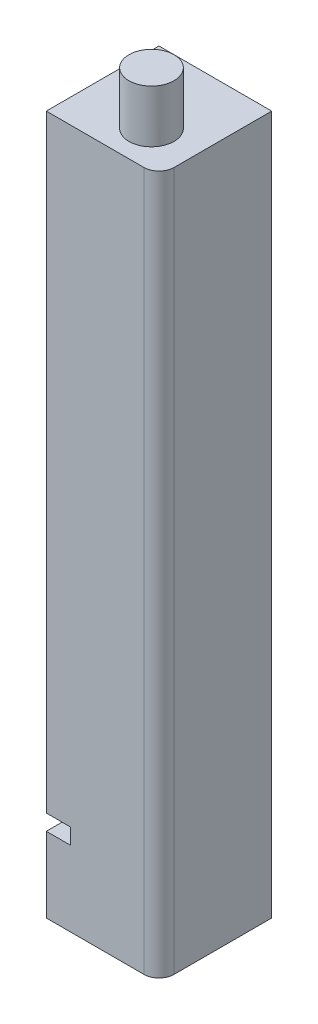
ISO-10303-21;
HEADER;
FILE_DESCRIPTION(('STEP AP214'),'2;1');
FILE_NAME('part.step','',(''),(''),'','','');
FILE_SCHEMA(('AUTOMOTIVE_DESIGN { 1 0 10303 214 1 1 1 1 }'));
ENDSEC;
DATA;
#1=APPLICATION_CONTEXT('core data for automotive mechanical design processes');
#2=APPLICATION_PROTOCOL_DEFINITION('international standard','automotive_design',2000,#1);
#3=PRODUCT_CONTEXT('',#1,'mechanical');
#4=PRODUCT('Part','Part','',(#3));
#5=PRODUCT_RELATED_PRODUCT_CATEGORY('part','',(#4));
#6=PRODUCT_DEFINITION_FORMATION('','',#4);
#7=PRODUCT_DEFINITION_CONTEXT('part definition',#1,'design');
#8=PRODUCT_DEFINITION('design','',#6,#7);
#9=PRODUCT_DEFINITION_SHAPE('','',#8);
#10=(LENGTH_UNIT() NAMED_UNIT(*) SI_UNIT(.MILLI.,.METRE.));
#11=(NAMED_UNIT(*) PLANE_ANGLE_UNIT() SI_UNIT($,.RADIAN.));
#12=(NAMED_UNIT(*) SI_UNIT($,.STERADIAN.) SOLID_ANGLE_UNIT());
#13=UNCERTAINTY_MEASURE_WITH_UNIT(LENGTH_MEASURE(1.E-05),#10,'distance_accuracy_value','');
#14=(GEOMETRIC_REPRESENTATION_CONTEXT(3) GLOBAL_UNCERTAINTY_ASSIGNED_CONTEXT((#13)) GLOBAL_UNIT_ASSIGNED_CONTEXT((#10,
#11,#12)) REPRESENTATION_CONTEXT('',''));
#15=CARTESIAN_POINT('',(0.,0.,0.));
#16=DIRECTION('',(0.,0.,1.));
#17=DIRECTION('',(1.,0.,0.));
#18=AXIS2_PLACEMENT_3D('',#15,#16,#17);
#19=CARTESIAN_POINT('',(-7.5,93.,7.5));
#20=DIRECTION('',(1.,0.,0.));
#21=DIRECTION('',(0.,0.,-1.));
#22=AXIS2_PLACEMENT_3D('',#19,#20,#21);
#23=PLANE('',#22);
#24=DIRECTION('',(0.,-1.,0.));
#25=VECTOR('',#24,1.);
#26=CARTESIAN_POINT('',(-7.5,93.,-7.5));
#27=LINE('',#26,#25);
#28=CARTESIAN_POINT('',(-7.5,93.,-7.5));
#29=VERTEX_POINT('',#28);
#30=CARTESIAN_POINT('',(-7.5,12.1,-7.5));
#31=VERTEX_POINT('',#30);
#32=EDGE_CURVE('E130',#29,#31,#27,.T.);
#33=ORIENTED_EDGE('',*,*,#32,.T.);
#34=DIRECTION('',(0.,0.,1.));
#35=VECTOR('',#34,1.);
#36=CARTESIAN_POINT('',(-7.5,12.1,-7.5));
#37=LINE('',#36,#35);
#38=CARTESIAN_POINT('',(-7.5,12.1,7.5));
#39=VERTEX_POINT('',#38);
#40=EDGE_CURVE('E161',#31,#39,#37,.T.);
#41=ORIENTED_EDGE('',*,*,#40,.T.);
#42=DIRECTION('',(0.,-1.,0.));
#43=VECTOR('',#42,1.);
#44=CARTESIAN_POINT('',(-7.5,93.,7.5));
#45=LINE('',#44,#43);
#46=CARTESIAN_POINT('',(-7.5,93.,7.5));
#47=VERTEX_POINT('',#46);
#48=EDGE_CURVE('E131',#47,#39,#45,.T.);
#49=ORIENTED_EDGE('',*,*,#48,.F.);
#50=DIRECTION('',(0.,0.,1.));
#51=VECTOR('',#50,1.);
#52=CARTESIAN_POINT('',(-7.5,93.,7.5));
#53=LINE('',#52,#51);
#54=EDGE_CURVE('E172',#29,#47,#53,.T.);
#55=ORIENTED_EDGE('',*,*,#54,.F.);
#56=EDGE_LOOP('',(#33,#41,#49,#55));
#57=FACE_BOUND('',#56,.T.);
#58=ADVANCED_FACE('F32',(#57),#23,.F.);
#59=CARTESIAN_POINT('',(7.5,93.,7.5));
#60=DIRECTION('',(-1.,0.,0.));
#61=DIRECTION('',(0.,0.,1.));
#62=AXIS2_PLACEMENT_3D('',#59,#60,#61);
#63=PLANE('',#62);
#64=DIRECTION('',(0.,0.,-1.));
#65=VECTOR('',#64,1.);
#66=CARTESIAN_POINT('',(7.5,93.,7.5));
#67=LINE('',#66,#65);
#68=CARTESIAN_POINT('',(7.5,93.,5.5));
#69=VERTEX_POINT('',#68);
#70=CARTESIAN_POINT('',(7.5,93.,-7.5));
#71=VERTEX_POINT('',#70);
#72=EDGE_CURVE('E152',#69,#71,#67,.T.);
#73=ORIENTED_EDGE('',*,*,#72,.F.);
#74=DIRECTION('',(0.,-1.,0.));
#75=VECTOR('',#74,1.);
#76=CARTESIAN_POINT('',(7.5,93.,5.5));
#77=LINE('',#76,#75);
#78=CARTESIAN_POINT('',(7.5,0.,5.5));
#79=VERTEX_POINT('',#78);
#80=EDGE_CURVE('E143',#69,#79,#77,.T.);
#81=ORIENTED_EDGE('',*,*,#80,.T.);
#82=DIRECTION('',(0.,0.,-1.));
#83=VECTOR('',#82,1.);
#84=CARTESIAN_POINT('',(7.5,0.,7.5));
#85=LINE('',#84,#83);
#86=CARTESIAN_POINT('',(7.5,0.,-7.5));
#87=VERTEX_POINT('',#86);
#88=EDGE_CURVE('E151',#79,#87,#85,.T.);
#89=ORIENTED_EDGE('',*,*,#88,.T.);
#90=DIRECTION('',(0.,-1.,0.));
#91=VECTOR('',#90,1.);
#92=CARTESIAN_POINT('',(7.5,93.,-7.5));
#93=LINE('',#92,#91);
#94=EDGE_CURVE('E134',#71,#87,#93,.T.);
#95=ORIENTED_EDGE('',*,*,#94,.F.);
#96=EDGE_LOOP('',(#73,#81,#89,#95));
#97=FACE_BOUND('',#96,.T.);
#98=ADVANCED_FACE('F149',(#97),#63,.F.);
#99=CARTESIAN_POINT('',(-7.5,93.,-7.5));
#100=DIRECTION('',(0.,0.,1.));
#101=DIRECTION('',(1.,0.,0.));
#102=AXIS2_PLACEMENT_3D('',#99,#100,#101);
#103=PLANE('',#102);
#104=DIRECTION('',(0.,1.,0.));
#105=VECTOR('',#104,1.);
#106=CARTESIAN_POINT('',(-4.30000000000001,12.1,-7.5));
#107=LINE('',#106,#105);
#108=CARTESIAN_POINT('',(-4.3,10.,-7.5));
#109=VERTEX_POINT('',#108);
#110=CARTESIAN_POINT('',(-4.30000000000001,12.1,-7.5));
#111=VERTEX_POINT('',#110);
#112=EDGE_CURVE('E113',#109,#111,#107,.T.);
#113=ORIENTED_EDGE('',*,*,#112,.T.);
#114=DIRECTION('',(-1.,0.,0.));
#115=VECTOR('',#114,1.);
#116=CARTESIAN_POINT('',(-7.5,12.1,-7.5));
#117=LINE('',#116,#115);
#118=EDGE_CURVE('E123',#111,#31,#117,.T.);
#119=ORIENTED_EDGE('',*,*,#118,.T.);
#120=ORIENTED_EDGE('',*,*,#32,.F.);
#121=DIRECTION('',(-1.,0.,0.));
#122=VECTOR('',#121,1.);
#123=CARTESIAN_POINT('',(-7.5,93.,-7.5));
#124=LINE('',#123,#122);
#125=EDGE_CURVE('E168',#71,#29,#124,.T.);
#126=ORIENTED_EDGE('',*,*,#125,.F.);
#127=ORIENTED_EDGE('',*,*,#94,.T.);
#128=DIRECTION('',(-1.,0.,0.));
#129=VECTOR('',#128,1.);
#130=CARTESIAN_POINT('',(-7.5,0.,-7.5));
#131=LINE('',#130,#129);
#132=CARTESIAN_POINT('',(-7.5,0.,-7.5));
#133=VERTEX_POINT('',#132);
#134=EDGE_CURVE('E128',#87,#133,#131,.T.);
#135=ORIENTED_EDGE('',*,*,#134,.T.);
#136=CARTESIAN_POINT('',(-7.5,10.,-7.5));
#137=VERTEX_POINT('',#136);
#138=EDGE_CURVE('E120',#137,#133,#27,.T.);
#139=ORIENTED_EDGE('',*,*,#138,.F.);
#140=DIRECTION('',(1.,0.,0.));
#141=VECTOR('',#140,1.);
#142=CARTESIAN_POINT('',(-4.3,10.,-7.5));
#143=LINE('',#142,#141);
#144=EDGE_CURVE('E102',#137,#109,#143,.T.);
#145=ORIENTED_EDGE('',*,*,#144,.T.);
#146=EDGE_LOOP('',(#113,#119,#120,#126,#127,#135,#139,#145));
#147=FACE_BOUND('',#146,.T.);
#148=ADVANCED_FACE('F125',(#147),#103,.F.);
#149=CARTESIAN_POINT('',(-7.5,10.,7.5));
#150=VERTEX_POINT('',#149);
#151=CARTESIAN_POINT('',(-7.5,0.,7.5));
#152=VERTEX_POINT('',#151);
#153=EDGE_CURVE('E122',#150,#152,#45,.T.);
#154=ORIENTED_EDGE('',*,*,#153,.F.);
#155=DIRECTION('',(0.,0.,1.));
#156=VECTOR('',#155,1.);
#157=CARTESIAN_POINT('',(-7.5,10.,-7.5));
#158=LINE('',#157,#156);
#159=EDGE_CURVE('E106',#137,#150,#158,.T.);
#160=ORIENTED_EDGE('',*,*,#159,.F.);
#161=ORIENTED_EDGE('',*,*,#138,.T.);
#162=DIRECTION('',(0.,0.,1.));
#163=VECTOR('',#162,1.);
#164=CARTESIAN_POINT('',(-7.5,0.,7.5));
#165=LINE('',#164,#163);
#166=EDGE_CURVE('E158',#133,#152,#165,.T.);
#167=ORIENTED_EDGE('',*,*,#166,.T.);
#168=EDGE_LOOP('',(#154,#160,#161,#167));
#169=FACE_BOUND('',#168,.T.);
#170=ADVANCED_FACE('F118',(#169),#23,.F.);
#171=CARTESIAN_POINT('',(-7.5,93.,7.5));
#172=DIRECTION('',(0.,0.,-1.));
#173=DIRECTION('',(-1.,0.,0.));
#174=AXIS2_PLACEMENT_3D('',#171,#172,#173);
#175=PLANE('',#174);
#176=DIRECTION('',(1.,0.,0.));
#177=VECTOR('',#176,1.);
#178=CARTESIAN_POINT('',(-7.5,0.,7.5));
#179=LINE('',#178,#177);
#180=CARTESIAN_POINT('',(5.49999999999999,0.,7.5));
#181=VERTEX_POINT('',#180);
#182=EDGE_CURVE('E167',#152,#181,#179,.T.);
#183=ORIENTED_EDGE('',*,*,#182,.T.);
#184=DIRECTION('',(0.,-1.,0.));
#185=VECTOR('',#184,1.);
#186=CARTESIAN_POINT('',(5.5,93.,7.5));
#187=LINE('',#186,#185);
#188=CARTESIAN_POINT('',(5.49999999999999,93.,7.5));
#189=VERTEX_POINT('',#188);
#190=EDGE_CURVE('E40',#181,#189,#187,.F.);
#191=ORIENTED_EDGE('',*,*,#190,.T.);
#192=DIRECTION('',(1.,0.,0.));
#193=VECTOR('',#192,1.);
#194=CARTESIAN_POINT('',(-7.5,93.,7.5));
#195=LINE('',#194,#193);
#196=EDGE_CURVE('E164',#47,#189,#195,.T.);
#197=ORIENTED_EDGE('',*,*,#196,.F.);
#198=ORIENTED_EDGE('',*,*,#48,.T.);
#199=DIRECTION('',(-1.,0.,0.));
#200=VECTOR('',#199,1.);
#201=CARTESIAN_POINT('',(-7.5,12.1,7.5));
#202=LINE('',#201,#200);
#203=CARTESIAN_POINT('',(-4.30000000000001,12.1,7.5));
#204=VERTEX_POINT('',#203);
#205=EDGE_CURVE('E114',#204,#39,#202,.T.);
#206=ORIENTED_EDGE('',*,*,#205,.F.);
#207=DIRECTION('',(0.,1.,0.));
#208=VECTOR('',#207,1.);
#209=CARTESIAN_POINT('',(-4.30000000000001,12.1,7.5));
#210=LINE('',#209,#208);
#211=CARTESIAN_POINT('',(-4.3,10.,7.5));
#212=VERTEX_POINT('',#211);
#213=EDGE_CURVE('E181',#212,#204,#210,.T.);
#214=ORIENTED_EDGE('',*,*,#213,.F.);
#215=DIRECTION('',(1.,0.,0.));
#216=VECTOR('',#215,1.);
#217=CARTESIAN_POINT('',(-4.3,10.,7.5));
#218=LINE('',#217,#216);
#219=EDGE_CURVE('E178',#150,#212,#218,.T.);
#220=ORIENTED_EDGE('',*,*,#219,.F.);
#221=ORIENTED_EDGE('',*,*,#153,.T.);
#222=EDGE_LOOP('',(#183,#191,#197,#198,#206,#214,#220,#221));
#223=FACE_BOUND('',#222,.T.);
#224=ADVANCED_FACE('F176',(#223),#175,.F.);
#225=CARTESIAN_POINT('',(0.,93.,0.));
#226=DIRECTION('',(0.,-1.,0.));
#227=DIRECTION('',(0.,0.,-1.));
#228=AXIS2_PLACEMENT_3D('',#225,#226,#227);
#229=PLANE('',#228);
#230=CARTESIAN_POINT('',(1.5,93.,2.5));
#231=DIRECTION('',(0.,-1.,0.));
#232=DIRECTION('',(0.,0.,-1.));
#233=AXIS2_PLACEMENT_3D('',#230,#231,#232);
#234=CIRCLE('',#233,3.);
#235=CARTESIAN_POINT('',(1.5,93.,-0.5));
#236=VERTEX_POINT('',#235);
#237=EDGE_CURVE('E140',#236,#236,#234,.F.);
#238=ORIENTED_EDGE('',*,*,#237,.F.);
#239=EDGE_LOOP('',(#238));
#240=FACE_BOUND('',#239,.T.);
#241=ORIENTED_EDGE('',*,*,#196,.T.);
#242=CARTESIAN_POINT('',(5.5,93.,5.5));
#243=DIRECTION('',(0.,-1.,0.));
#244=DIRECTION('',(0.,0.,-1.));
#245=AXIS2_PLACEMENT_3D('',#242,#243,#244);
#246=CIRCLE('',#245,2.);
#247=EDGE_CURVE('E11',#189,#69,#246,.F.);
#248=ORIENTED_EDGE('',*,*,#247,.T.);
#249=ORIENTED_EDGE('',*,*,#72,.T.);
#250=ORIENTED_EDGE('',*,*,#125,.T.);
#251=ORIENTED_EDGE('',*,*,#54,.T.);
#252=EDGE_LOOP('',(#241,#248,#249,#250,#251));
#253=FACE_BOUND('',#252,.T.);
#254=ADVANCED_FACE('F223',(#240,#253),#229,.F.);
#255=CARTESIAN_POINT('',(0.,0.,0.));
#256=DIRECTION('',(0.,-1.,0.));
#257=DIRECTION('',(0.,0.,-1.));
#258=AXIS2_PLACEMENT_3D('',#255,#256,#257);
#259=PLANE('',#258);
#260=ORIENTED_EDGE('',*,*,#88,.F.);
#261=CARTESIAN_POINT('',(5.5,0.,5.5));
#262=DIRECTION('',(0.,-1.,0.));
#263=DIRECTION('',(0.,0.,-1.));
#264=AXIS2_PLACEMENT_3D('',#261,#262,#263);
#265=CIRCLE('',#264,2.);
#266=EDGE_CURVE('E54',#79,#181,#265,.T.);
#267=ORIENTED_EDGE('',*,*,#266,.T.);
#268=ORIENTED_EDGE('',*,*,#182,.F.);
#269=ORIENTED_EDGE('',*,*,#166,.F.);
#270=ORIENTED_EDGE('',*,*,#134,.F.);
#271=EDGE_LOOP('',(#260,#267,#268,#269,#270));
#272=FACE_BOUND('',#271,.T.);
#273=ADVANCED_FACE('F155',(#272),#259,.T.);
#274=CARTESIAN_POINT('',(1.5,100.,2.5));
#275=DIRECTION('',(0.,-1.,0.));
#276=DIRECTION('',(0.,0.,-1.));
#277=AXIS2_PLACEMENT_3D('',#274,#275,#276);
#278=CYLINDRICAL_SURFACE('',#277,3.);
#279=CARTESIAN_POINT('',(1.5,100.,2.5));
#280=DIRECTION('',(0.,1.,0.));
#281=DIRECTION('',(0.,0.,1.));
#282=AXIS2_PLACEMENT_3D('',#279,#280,#281);
#283=CIRCLE('',#282,3.);
#284=CARTESIAN_POINT('',(1.5,100.,5.5));
#285=VERTEX_POINT('',#284);
#286=EDGE_CURVE('E156',#285,#285,#283,.T.);
#287=ORIENTED_EDGE('',*,*,#286,.F.);
#288=EDGE_LOOP('',(#287));
#289=FACE_BOUND('',#288,.T.);
#290=ORIENTED_EDGE('',*,*,#237,.T.);
#291=EDGE_LOOP('',(#290));
#292=FACE_BOUND('',#291,.T.);
#293=ADVANCED_FACE('F208',(#289,#292),#278,.T.);
#294=CARTESIAN_POINT('',(1.5,100.,2.5));
#295=DIRECTION('',(0.,1.,0.));
#296=DIRECTION('',(0.,0.,1.));
#297=AXIS2_PLACEMENT_3D('',#294,#295,#296);
#298=PLANE('',#297);
#299=ORIENTED_EDGE('',*,*,#286,.T.);
#300=EDGE_LOOP('',(#299));
#301=FACE_BOUND('',#300,.T.);
#302=ADVANCED_FACE('F201',(#301),#298,.T.);
#303=CARTESIAN_POINT('',(-7.5,12.1,-7.5));
#304=DIRECTION('',(0.,1.,0.));
#305=DIRECTION('',(-1.,0.,0.));
#306=AXIS2_PLACEMENT_3D('',#303,#304,#305);
#307=PLANE('',#306);
#308=ORIENTED_EDGE('',*,*,#205,.T.);
#309=ORIENTED_EDGE('',*,*,#40,.F.);
#310=ORIENTED_EDGE('',*,*,#118,.F.);
#311=DIRECTION('',(0.,0.,1.));
#312=VECTOR('',#311,1.);
#313=CARTESIAN_POINT('',(-4.30000000000001,12.1,-7.5));
#314=LINE('',#313,#312);
#315=EDGE_CURVE('E190',#111,#204,#314,.T.);
#316=ORIENTED_EDGE('',*,*,#315,.T.);
#317=EDGE_LOOP('',(#308,#309,#310,#316));
#318=FACE_BOUND('',#317,.T.);
#319=ADVANCED_FACE('F199',(#318),#307,.F.);
#320=CARTESIAN_POINT('',(-4.30000000000001,12.1,-7.5));
#321=DIRECTION('',(1.,0.,0.));
#322=DIRECTION('',(0.,1.,0.));
#323=AXIS2_PLACEMENT_3D('',#320,#321,#322);
#324=PLANE('',#323);
#325=ORIENTED_EDGE('',*,*,#213,.T.);
#326=ORIENTED_EDGE('',*,*,#315,.F.);
#327=ORIENTED_EDGE('',*,*,#112,.F.);
#328=DIRECTION('',(0.,0.,1.));
#329=VECTOR('',#328,1.);
#330=CARTESIAN_POINT('',(-4.3,10.,-7.5));
#331=LINE('',#330,#329);
#332=EDGE_CURVE('E108',#109,#212,#331,.T.);
#333=ORIENTED_EDGE('',*,*,#332,.T.);
#334=EDGE_LOOP('',(#325,#326,#327,#333));
#335=FACE_BOUND('',#334,.T.);
#336=ADVANCED_FACE('F193',(#335),#324,.F.);
#337=CARTESIAN_POINT('',(-4.3,10.,-7.5));
#338=DIRECTION('',(0.,-1.,0.));
#339=DIRECTION('',(0.,0.,-1.));
#340=AXIS2_PLACEMENT_3D('',#337,#338,#339);
#341=PLANE('',#340);
#342=ORIENTED_EDGE('',*,*,#219,.T.);
#343=ORIENTED_EDGE('',*,*,#332,.F.);
#344=ORIENTED_EDGE('',*,*,#144,.F.);
#345=ORIENTED_EDGE('',*,*,#159,.T.);
#346=EDGE_LOOP('',(#342,#343,#344,#345));
#347=FACE_BOUND('',#346,.T.);
#348=ADVANCED_FACE('F105',(#347),#341,.F.);
#349=CARTESIAN_POINT('',(5.5,93.,5.5));
#350=DIRECTION('',(0.,-1.,0.));
#351=DIRECTION('',(0.,0.,-1.));
#352=AXIS2_PLACEMENT_3D('',#349,#350,#351);
#353=CYLINDRICAL_SURFACE('',#352,2.);
#354=ORIENTED_EDGE('',*,*,#247,.F.);
#355=ORIENTED_EDGE('',*,*,#190,.F.);
#356=ORIENTED_EDGE('',*,*,#266,.F.);
#357=ORIENTED_EDGE('',*,*,#80,.F.);
#358=EDGE_LOOP('',(#354,#355,#356,#357));
#359=FACE_BOUND('',#358,.T.);
#360=ADVANCED_FACE('F34',(#359),#353,.T.);
#361=CLOSED_SHELL('',(#58,#98,#148,#170,#224,#254,#273,#293,#302,#319,#336,#348,#360));
#362=MANIFOLD_SOLID_BREP('B2',#361);
#363=ADVANCED_BREP_SHAPE_REPRESENTATION('',(#18,#362),#14);
#364=SHAPE_DEFINITION_REPRESENTATION(#9,#363);
ENDSEC;
END-ISO-10303-21;
